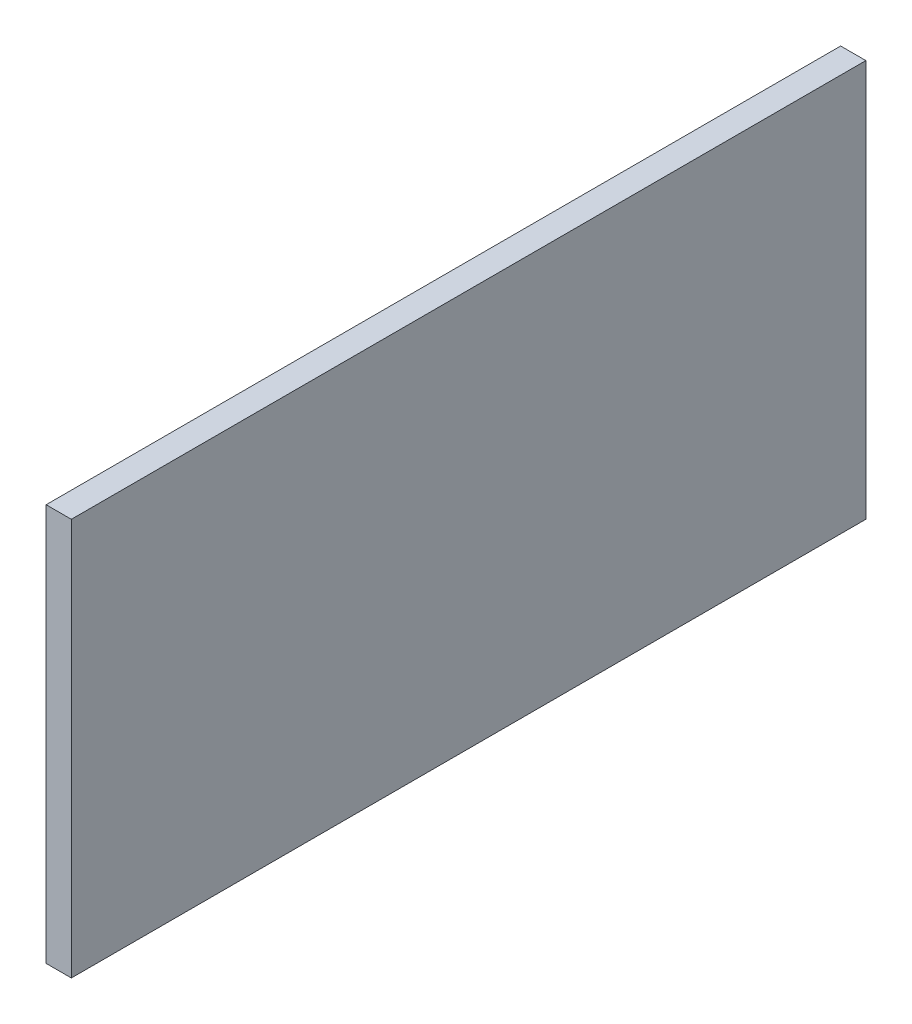
ISO-10303-21;
HEADER;
FILE_DESCRIPTION(('STEP AP214'),'2;1');
FILE_NAME('part.step','',(''),(''),'','','');
FILE_SCHEMA(('AUTOMOTIVE_DESIGN { 1 0 10303 214 1 1 1 1 }'));
ENDSEC;
DATA;
#1=APPLICATION_CONTEXT('core data for automotive mechanical design processes');
#2=APPLICATION_PROTOCOL_DEFINITION('international standard','automotive_design',2000,#1);
#3=PRODUCT_CONTEXT('',#1,'mechanical');
#4=PRODUCT('Part','Part','',(#3));
#5=PRODUCT_RELATED_PRODUCT_CATEGORY('part','',(#4));
#6=PRODUCT_DEFINITION_FORMATION('','',#4);
#7=PRODUCT_DEFINITION_CONTEXT('part definition',#1,'design');
#8=PRODUCT_DEFINITION('design','',#6,#7);
#9=PRODUCT_DEFINITION_SHAPE('','',#8);
#10=(LENGTH_UNIT() NAMED_UNIT(*) SI_UNIT(.MILLI.,.METRE.));
#11=(NAMED_UNIT(*) PLANE_ANGLE_UNIT() SI_UNIT($,.RADIAN.));
#12=(NAMED_UNIT(*) SI_UNIT($,.STERADIAN.) SOLID_ANGLE_UNIT());
#13=UNCERTAINTY_MEASURE_WITH_UNIT(LENGTH_MEASURE(1.E-05),#10,'distance_accuracy_value','');
#14=(GEOMETRIC_REPRESENTATION_CONTEXT(3) GLOBAL_UNCERTAINTY_ASSIGNED_CONTEXT((#13)) GLOBAL_UNIT_ASSIGNED_CONTEXT((#10,
#11,#12)) REPRESENTATION_CONTEXT('',''));
#15=CARTESIAN_POINT('',(0.,0.,0.));
#16=DIRECTION('',(0.,0.,1.));
#17=DIRECTION('',(1.,0.,0.));
#18=AXIS2_PLACEMENT_3D('',#15,#16,#17);
#19=CARTESIAN_POINT('',(0.635,5.,-10.));
#20=DIRECTION('',(0.,0.,1.));
#21=DIRECTION('',(1.,0.,0.));
#22=AXIS2_PLACEMENT_3D('',#19,#20,#21);
#23=PLANE('',#22);
#24=DIRECTION('',(0.,1.,0.));
#25=VECTOR('',#24,1.);
#26=CARTESIAN_POINT('',(0.,5.,-10.));
#27=LINE('',#26,#25);
#28=CARTESIAN_POINT('',(0.,-5.,-10.));
#29=VERTEX_POINT('',#28);
#30=CARTESIAN_POINT('',(0.,5.,-10.));
#31=VERTEX_POINT('',#30);
#32=EDGE_CURVE('E102',#29,#31,#27,.T.);
#33=ORIENTED_EDGE('',*,*,#32,.T.);
#34=DIRECTION('',(-1.,0.,0.));
#35=VECTOR('',#34,1.);
#36=CARTESIAN_POINT('',(0.635,5.,-10.));
#37=LINE('',#36,#35);
#38=CARTESIAN_POINT('',(0.635,5.,-10.));
#39=VERTEX_POINT('',#38);
#40=EDGE_CURVE('E11',#39,#31,#37,.T.);
#41=ORIENTED_EDGE('',*,*,#40,.F.);
#42=DIRECTION('',(0.,1.,0.));
#43=VECTOR('',#42,1.);
#44=CARTESIAN_POINT('',(0.635,5.,-10.));
#45=LINE('',#44,#43);
#46=CARTESIAN_POINT('',(0.635,-5.,-10.));
#47=VERTEX_POINT('',#46);
#48=EDGE_CURVE('E90',#47,#39,#45,.T.);
#49=ORIENTED_EDGE('',*,*,#48,.F.);
#50=DIRECTION('',(-1.,0.,0.));
#51=VECTOR('',#50,1.);
#52=CARTESIAN_POINT('',(0.635,-5.,-10.));
#53=LINE('',#52,#51);
#54=EDGE_CURVE('E98',#47,#29,#53,.T.);
#55=ORIENTED_EDGE('',*,*,#54,.T.);
#56=EDGE_LOOP('',(#33,#41,#49,#55));
#57=FACE_BOUND('',#56,.T.);
#58=ADVANCED_FACE('F39',(#57),#23,.F.);
#59=CARTESIAN_POINT('',(0.635,5.,10.));
#60=DIRECTION('',(0.,-1.,0.));
#61=DIRECTION('',(0.,0.,-1.));
#62=AXIS2_PLACEMENT_3D('',#59,#60,#61);
#63=PLANE('',#62);
#64=DIRECTION('',(0.,0.,1.));
#65=VECTOR('',#64,1.);
#66=CARTESIAN_POINT('',(0.,5.,10.));
#67=LINE('',#66,#65);
#68=CARTESIAN_POINT('',(0.,5.,10.));
#69=VERTEX_POINT('',#68);
#70=EDGE_CURVE('E94',#31,#69,#67,.T.);
#71=ORIENTED_EDGE('',*,*,#70,.T.);
#72=DIRECTION('',(-1.,0.,0.));
#73=VECTOR('',#72,1.);
#74=CARTESIAN_POINT('',(0.635,5.,10.));
#75=LINE('',#74,#73);
#76=CARTESIAN_POINT('',(0.635,5.,10.));
#77=VERTEX_POINT('',#76);
#78=EDGE_CURVE('E47',#77,#69,#75,.T.);
#79=ORIENTED_EDGE('',*,*,#78,.F.);
#80=DIRECTION('',(0.,0.,1.));
#81=VECTOR('',#80,1.);
#82=CARTESIAN_POINT('',(0.635,5.,10.));
#83=LINE('',#82,#81);
#84=EDGE_CURVE('E85',#39,#77,#83,.T.);
#85=ORIENTED_EDGE('',*,*,#84,.F.);
#86=ORIENTED_EDGE('',*,*,#40,.T.);
#87=EDGE_LOOP('',(#71,#79,#85,#86));
#88=FACE_BOUND('',#87,.T.);
#89=ADVANCED_FACE('F93',(#88),#63,.F.);
#90=CARTESIAN_POINT('',(0.635,5.,10.));
#91=DIRECTION('',(0.,0.,-1.));
#92=DIRECTION('',(-1.,0.,0.));
#93=AXIS2_PLACEMENT_3D('',#90,#91,#92);
#94=PLANE('',#93);
#95=DIRECTION('',(0.,-1.,0.));
#96=VECTOR('',#95,1.);
#97=CARTESIAN_POINT('',(0.,5.,10.));
#98=LINE('',#97,#96);
#99=CARTESIAN_POINT('',(0.,-5.,10.));
#100=VERTEX_POINT('',#99);
#101=EDGE_CURVE('E72',#69,#100,#98,.T.);
#102=ORIENTED_EDGE('',*,*,#101,.T.);
#103=DIRECTION('',(-1.,0.,0.));
#104=VECTOR('',#103,1.);
#105=CARTESIAN_POINT('',(0.635,-5.,10.));
#106=LINE('',#105,#104);
#107=CARTESIAN_POINT('',(0.635,-5.,10.));
#108=VERTEX_POINT('',#107);
#109=EDGE_CURVE('E95',#108,#100,#106,.T.);
#110=ORIENTED_EDGE('',*,*,#109,.F.);
#111=DIRECTION('',(0.,-1.,0.));
#112=VECTOR('',#111,1.);
#113=CARTESIAN_POINT('',(0.635,5.,10.));
#114=LINE('',#113,#112);
#115=EDGE_CURVE('E88',#77,#108,#114,.T.);
#116=ORIENTED_EDGE('',*,*,#115,.F.);
#117=ORIENTED_EDGE('',*,*,#78,.T.);
#118=EDGE_LOOP('',(#102,#110,#116,#117));
#119=FACE_BOUND('',#118,.T.);
#120=ADVANCED_FACE('F96',(#119),#94,.F.);
#121=CARTESIAN_POINT('',(0.635,-5.,10.));
#122=DIRECTION('',(0.,1.,0.));
#123=DIRECTION('',(0.,0.,1.));
#124=AXIS2_PLACEMENT_3D('',#121,#122,#123);
#125=PLANE('',#124);
#126=DIRECTION('',(0.,0.,-1.));
#127=VECTOR('',#126,1.);
#128=CARTESIAN_POINT('',(0.,-5.,10.));
#129=LINE('',#128,#127);
#130=EDGE_CURVE('E78',#100,#29,#129,.T.);
#131=ORIENTED_EDGE('',*,*,#130,.T.);
#132=ORIENTED_EDGE('',*,*,#54,.F.);
#133=DIRECTION('',(0.,0.,-1.));
#134=VECTOR('',#133,1.);
#135=CARTESIAN_POINT('',(0.635,-5.,10.));
#136=LINE('',#135,#134);
#137=EDGE_CURVE('E55',#108,#47,#136,.T.);
#138=ORIENTED_EDGE('',*,*,#137,.F.);
#139=ORIENTED_EDGE('',*,*,#109,.T.);
#140=EDGE_LOOP('',(#131,#132,#138,#139));
#141=FACE_BOUND('',#140,.T.);
#142=ADVANCED_FACE('F109',(#141),#125,.F.);
#143=CARTESIAN_POINT('',(0.635,0.,0.));
#144=DIRECTION('',(1.,0.,0.));
#145=DIRECTION('',(0.,0.,-1.));
#146=AXIS2_PLACEMENT_3D('',#143,#144,#145);
#147=PLANE('',#146);
#148=ORIENTED_EDGE('',*,*,#48,.T.);
#149=ORIENTED_EDGE('',*,*,#84,.T.);
#150=ORIENTED_EDGE('',*,*,#115,.T.);
#151=ORIENTED_EDGE('',*,*,#137,.T.);
#152=EDGE_LOOP('',(#148,#149,#150,#151));
#153=FACE_BOUND('',#152,.T.);
#154=ADVANCED_FACE('F86',(#153),#147,.T.);
#155=CARTESIAN_POINT('',(0.,0.,0.));
#156=DIRECTION('',(1.,0.,0.));
#157=DIRECTION('',(0.,0.,-1.));
#158=AXIS2_PLACEMENT_3D('',#155,#156,#157);
#159=PLANE('',#158);
#160=ORIENTED_EDGE('',*,*,#32,.F.);
#161=ORIENTED_EDGE('',*,*,#130,.F.);
#162=ORIENTED_EDGE('',*,*,#101,.F.);
#163=ORIENTED_EDGE('',*,*,#70,.F.);
#164=EDGE_LOOP('',(#160,#161,#162,#163));
#165=FACE_BOUND('',#164,.T.);
#166=ADVANCED_FACE('F112',(#165),#159,.F.);
#167=CLOSED_SHELL('',(#58,#89,#120,#142,#154,#166));
#168=MANIFOLD_SOLID_BREP('B2',#167);
#169=ADVANCED_BREP_SHAPE_REPRESENTATION('',(#18,#168),#14);
#170=SHAPE_DEFINITION_REPRESENTATION(#9,#169);
ENDSEC;
END-ISO-10303-21;
